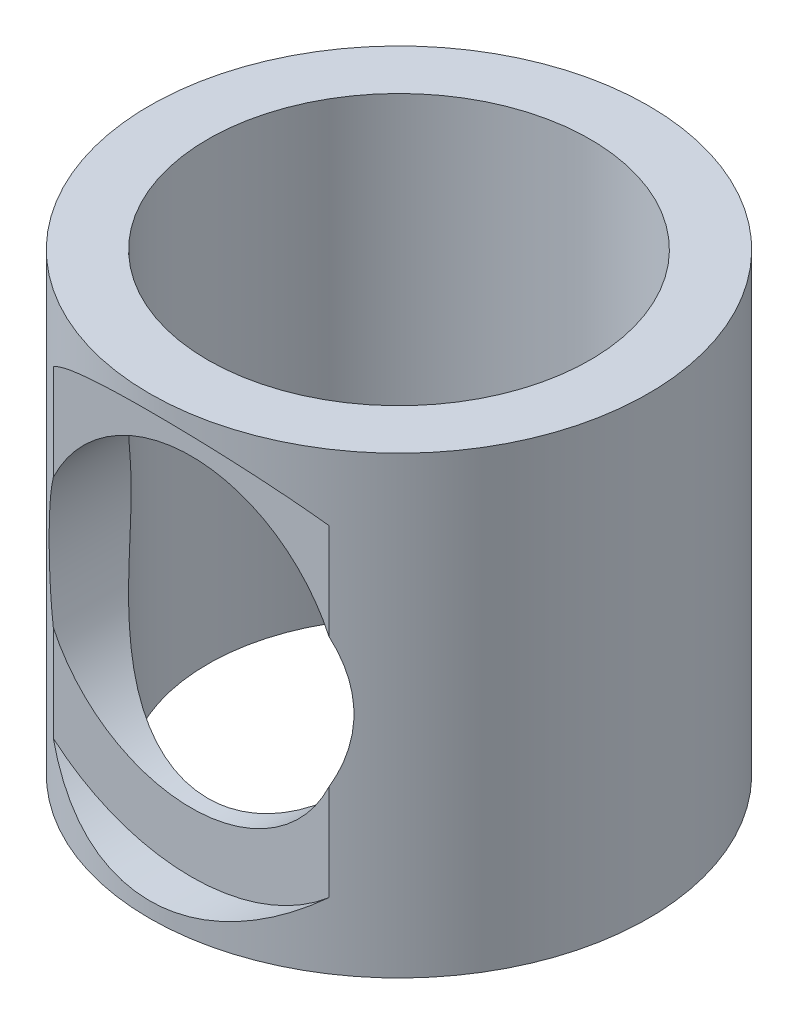
ISO-10303-21;
HEADER;
FILE_DESCRIPTION(('STEP AP214'),'2;1');
FILE_NAME('part.step','',(''),(''),'','','');
FILE_SCHEMA(('AUTOMOTIVE_DESIGN { 1 0 10303 214 1 1 1 1 }'));
ENDSEC;
DATA;
#1=APPLICATION_CONTEXT('core data for automotive mechanical design processes');
#2=APPLICATION_PROTOCOL_DEFINITION('international standard','automotive_design',2000,#1);
#3=PRODUCT_CONTEXT('',#1,'mechanical');
#4=PRODUCT('Part','Part','',(#3));
#5=PRODUCT_RELATED_PRODUCT_CATEGORY('part','',(#4));
#6=PRODUCT_DEFINITION_FORMATION('','',#4);
#7=PRODUCT_DEFINITION_CONTEXT('part definition',#1,'design');
#8=PRODUCT_DEFINITION('design','',#6,#7);
#9=PRODUCT_DEFINITION_SHAPE('','',#8);
#10=(LENGTH_UNIT() NAMED_UNIT(*) SI_UNIT(.MILLI.,.METRE.));
#11=(NAMED_UNIT(*) PLANE_ANGLE_UNIT() SI_UNIT($,.RADIAN.));
#12=(NAMED_UNIT(*) SI_UNIT($,.STERADIAN.) SOLID_ANGLE_UNIT());
#13=UNCERTAINTY_MEASURE_WITH_UNIT(LENGTH_MEASURE(1.E-05),#10,'distance_accuracy_value','');
#14=(GEOMETRIC_REPRESENTATION_CONTEXT(3) GLOBAL_UNCERTAINTY_ASSIGNED_CONTEXT((#13)) GLOBAL_UNIT_ASSIGNED_CONTEXT((#10,
#11,#12)) REPRESENTATION_CONTEXT('',''));
#15=CARTESIAN_POINT('',(0.,0.,0.));
#16=DIRECTION('',(0.,0.,1.));
#17=DIRECTION('',(1.,0.,0.));
#18=AXIS2_PLACEMENT_3D('',#15,#16,#17);
#19=CARTESIAN_POINT('',(0.,-16.4,0.));
#20=DIRECTION('',(0.,1.,0.));
#21=DIRECTION('',(0.,0.,1.));
#22=AXIS2_PLACEMENT_3D('',#19,#20,#21);
#23=CYLINDRICAL_SURFACE('',#22,9.);
#24=CARTESIAN_POINT('',(0.,-16.4,0.));
#25=DIRECTION('',(0.,1.,0.));
#26=DIRECTION('',(0.,0.,1.));
#27=AXIS2_PLACEMENT_3D('',#24,#25,#26);
#28=CIRCLE('',#27,9.);
#29=CARTESIAN_POINT('',(0.,-16.4,9.));
#30=VERTEX_POINT('',#29);
#31=EDGE_CURVE('E98',#30,#30,#28,.T.);
#32=ORIENTED_EDGE('',*,*,#31,.T.);
#33=EDGE_LOOP('',(#32));
#34=FACE_BOUND('',#33,.T.);
#35=CARTESIAN_POINT('',(0.,0.,0.));
#36=DIRECTION('',(0.,1.,0.));
#37=DIRECTION('',(0.,0.,1.));
#38=AXIS2_PLACEMENT_3D('',#35,#36,#37);
#39=CIRCLE('',#38,9.);
#40=CARTESIAN_POINT('',(0.,0.,9.));
#41=VERTEX_POINT('',#40);
#42=EDGE_CURVE('E104',#41,#41,#39,.T.);
#43=ORIENTED_EDGE('',*,*,#42,.F.);
#44=EDGE_LOOP('',(#43));
#45=FACE_BOUND('',#44,.T.);
#46=DIRECTION('',(0.,1.,0.));
#47=VECTOR('',#46,1.);
#48=CARTESIAN_POINT('',(-4.9749371855331,-16.4,7.5));
#49=LINE('',#48,#47);
#50=CARTESIAN_POINT('',(-4.9749371855331,-14.0114111883432,7.5));
#51=VERTEX_POINT('',#50);
#52=CARTESIAN_POINT('',(-4.9749371855331,-10.5452078799117,7.5));
#53=VERTEX_POINT('',#52);
#54=EDGE_CURVE('E89',#51,#53,#49,.T.);
#55=ORIENTED_EDGE('',*,*,#54,.T.);
#56=CARTESIAN_POINT('',(0.,-13.7,9.));
#57=CARTESIAN_POINT('',(-0.140320630117878,-13.6999990432062,8.99999909466136));
#58=CARTESIAN_POINT('',(-0.280664325059528,-13.6946221419773,8.99671042745866));
#59=CARTESIAN_POINT('',(-0.560285969297445,-13.6731854153599,8.98363446958722));
#60=CARTESIAN_POINT('',(-0.699563327861167,-13.6571200486794,8.97384380805122));
#61=CARTESIAN_POINT('',(-0.976151591572798,-13.6144934275367,8.9479858868973));
#62=CARTESIAN_POINT('',(-1.11345878047182,-13.5879145016786,8.93190806021111));
#63=CARTESIAN_POINT('',(-1.38492990005798,-13.524604063471,8.89386132037186));
#64=CARTESIAN_POINT('',(-1.51909246754203,-13.4878682332514,8.87188990187292));
#65=CARTESIAN_POINT('',(-1.78263645895926,-13.4049191327806,8.82270211631877));
#66=CARTESIAN_POINT('',(-1.91203991660257,-13.3587584910183,8.79551492315217));
#67=CARTESIAN_POINT('',(-2.16613234332127,-13.2573322993172,8.73641340897566));
#68=CARTESIAN_POINT('',(-2.29081946752619,-13.2020632308412,8.70449726167851));
#69=CARTESIAN_POINT('',(-2.65669593582049,-13.0234326328182,8.60266649502986));
#70=CARTESIAN_POINT('',(-2.89001661117095,-12.8871467777588,8.52660811005578));
#71=CARTESIAN_POINT('',(-3.34891610547489,-12.5724437402154,8.35758798657437));
#72=CARTESIAN_POINT('',(-3.57247114082575,-12.3915692902006,8.26377048053451));
#73=CARTESIAN_POINT('',(-3.98814984579349,-11.9982373622157,8.07137598962145));
#74=CARTESIAN_POINT('',(-4.18023164738023,-11.7857385203877,7.97279288723892));
#75=CARTESIAN_POINT('',(-4.45359431785187,-11.4313417915118,7.82165306001234));
#76=CARTESIAN_POINT('',(-4.54670436056964,-11.2989883219654,7.76774515933184));
#77=CARTESIAN_POINT('',(-4.72136793391075,-11.0257763111044,7.66283603334586));
#78=CARTESIAN_POINT('',(-4.8029194445551,-10.8849162892963,7.61183531703114));
#79=CARTESIAN_POINT('',(-5.02895084361821,-10.4507272252221,7.46603914343542));
#80=CARTESIAN_POINT('',(-5.1553418835838,-10.1451008428276,7.37813931813357));
#81=CARTESIAN_POINT('',(-5.32776453335166,-9.58827933784976,7.25419759048653));
#82=CARTESIAN_POINT('',(-5.38597609358415,-9.34251843238286,7.21068977998146));
#83=CARTESIAN_POINT('',(-5.44765014527462,-8.96758722740646,7.1640566655145));
#84=CARTESIAN_POINT('',(-5.463933597212,-8.84158728807766,7.15161767781163));
#85=CARTESIAN_POINT('',(-5.48775194768396,-8.58825916899246,7.13335987667991));
#86=CARTESIAN_POINT('',(-5.49528670810963,-8.46093096829984,7.12754116776036));
#87=CARTESIAN_POINT('',(-5.50148267930541,-8.20564574345148,7.12275928601538));
#88=CARTESIAN_POINT('',(-5.50012388031762,-8.07768794900362,7.12381157233655));
#89=CARTESIAN_POINT('',(-5.48851154377157,-7.82242054629702,7.13276205258463));
#90=CARTESIAN_POINT('',(-5.47825796107315,-7.69511094133109,7.14066028125404));
#91=CARTESIAN_POINT('',(-5.4490091669784,-7.44202203776785,7.16300474248471));
#92=CARTESIAN_POINT('',(-5.43000983053673,-7.31624349007981,7.17745406490368));
#93=CARTESIAN_POINT('',(-5.3835489247727,-7.06708919354641,7.21236688765609));
#94=CARTESIAN_POINT('',(-5.35608387779487,-6.94371445435466,7.23283285942751));
#95=CARTESIAN_POINT('',(-5.26260147274339,-6.58258635514391,7.30143669255829));
#96=CARTESIAN_POINT('',(-5.18493883957635,-6.34918929901148,7.35723458839015));
#97=CARTESIAN_POINT('',(-5.00116477145739,-5.89830623444891,7.48336153077569));
#98=CARTESIAN_POINT('',(-4.89504308293793,-5.68082599673934,7.55369581257306));
#99=CARTESIAN_POINT('',(-4.63534952776924,-5.22613390976096,7.71628295799306));
#100=CARTESIAN_POINT('',(-4.47667243069761,-4.99243289140703,7.81020139243674));
#101=CARTESIAN_POINT('',(-4.1260456433473,-4.55240542008156,8.00097319017906));
#102=CARTESIAN_POINT('',(-3.93406298979712,-4.34610644811324,8.09782938192896));
#103=CARTESIAN_POINT('',(-3.60763116888638,-4.04532759564363,8.24634640770807));
#104=CARTESIAN_POINT('',(-3.48332052784539,-3.94053533098166,8.2997510389037));
#105=CARTESIAN_POINT('',(-3.22509801164116,-3.74183192208319,8.40345586032043));
#106=CARTESIAN_POINT('',(-3.09118949862222,-3.64791699736955,8.45375712627491));
#107=CARTESIAN_POINT('',(-2.81438962227263,-3.4717739964979,8.54989351957859));
#108=CARTESIAN_POINT('',(-2.67149899756097,-3.3895449611918,8.59572901336982));
#109=CARTESIAN_POINT('',(-2.37752441744433,-3.23766820200902,8.68163660057312));
#110=CARTESIAN_POINT('',(-2.22644146795147,-3.16801893802609,8.72170939937325));
#111=CARTESIAN_POINT('',(-1.92630313993462,-3.045970534419,8.79270754888431));
#112=CARTESIAN_POINT('',(-1.77765994086073,-2.99279274334542,8.824034740525));
#113=CARTESIAN_POINT('',(-1.47514380894459,-2.89914997814178,8.8796165147892));
#114=CARTESIAN_POINT('',(-1.32127173530647,-2.85868292648101,8.90387225317309));
#115=CARTESIAN_POINT('',(-1.00975670206422,-2.79114003074001,8.94455362843908));
#116=CARTESIAN_POINT('',(-0.852117696517168,-2.76405074033224,8.96098712704998));
#117=CARTESIAN_POINT('',(-0.5344466993168,-2.72368830331122,8.98552894656546));
#118=CARTESIAN_POINT('',(-0.374415078679694,-2.7104130366797,8.99363854492437));
#119=CARTESIAN_POINT('',(-0.0763428712488212,-2.6988030871287,9.00073079501644));
#120=CARTESIAN_POINT('',(0.0616029459194025,-2.69861900539326,9.00084321349574));
#121=CARTESIAN_POINT('',(0.336975499558356,-2.70860449258568,8.99474333497655));
#122=CARTESIAN_POINT('',(0.474402267344441,-2.71877342654542,8.98853142585986));
#123=CARTESIAN_POINT('',(0.747678254996305,-2.74932284179092,8.96993507884819));
#124=CARTESIAN_POINT('',(0.883527583445614,-2.76970261589546,8.95755106842022));
#125=CARTESIAN_POINT('',(1.15268067966745,-2.82040118157957,8.92690743357053));
#126=CARTESIAN_POINT('',(1.28598439146398,-2.85072019144899,8.90864768010335));
#127=CARTESIAN_POINT('',(1.54509645170536,-2.91983960114835,8.86731919675696));
#128=CARTESIAN_POINT('',(1.67100912828581,-2.95834899282325,8.84441648984859));
#129=CARTESIAN_POINT('',(1.91893941419021,-3.04394599717721,8.79395842054805));
#130=CARTESIAN_POINT('',(2.04095575869607,-3.09103636278291,8.76640156523178));
#131=CARTESIAN_POINT('',(2.40016928301883,-3.2445087830621,8.67755033615854));
#132=CARTESIAN_POINT('',(2.63072425067249,-3.36314446825966,8.61004324830333));
#133=CARTESIAN_POINT('',(3.09274563378639,-3.64310151796286,8.45578461223622));
#134=CARTESIAN_POINT('',(3.32186846125941,-3.80755756871491,8.36776804337219));
#135=CARTESIAN_POINT('',(3.75098669115101,-4.167792874161,8.18441369069338));
#136=CARTESIAN_POINT('',(3.95094814013234,-4.36360809361603,8.0890675669462));
#137=CARTESIAN_POINT('',(4.34434965513174,-4.81216101998426,7.88556318802296));
#138=CARTESIAN_POINT('',(4.5331336620455,-5.06902235619793,7.77744129782893));
#139=CARTESIAN_POINT('',(4.86525646838855,-5.61518695629085,7.57411441787219));
#140=CARTESIAN_POINT('',(5.00863641800685,-5.90446052078361,7.47889777697765));
#141=CARTESIAN_POINT('',(5.21893504874632,-6.4456341054072,7.33318001562168));
#142=CARTESIAN_POINT('',(5.29565437277669,-6.69226058812352,7.27746922744331));
#143=CARTESIAN_POINT('',(5.38448104616078,-7.07117896290014,7.21170429345097));
#144=CARTESIAN_POINT('',(5.40971253573952,-7.19895951684521,7.19275119748605));
#145=CARTESIAN_POINT('',(5.45111024536707,-7.45675594839651,7.16143037165602));
#146=CARTESIAN_POINT('',(5.46728019366359,-7.58677088397028,7.14905993355184));
#147=CARTESIAN_POINT('',(5.49035446517654,-7.8487379948186,7.13135472031657));
#148=CARTESIAN_POINT('',(5.49721341703763,-7.98069651120785,7.12605439916844));
#149=CARTESIAN_POINT('',(5.50140322550147,-8.24485593087546,7.12282036199894));
#150=CARTESIAN_POINT('',(5.49873408527627,-8.37705683407312,7.12488664352512));
#151=CARTESIAN_POINT('',(5.48390762991169,-8.64066555842503,7.13630478485499));
#152=CARTESIAN_POINT('',(5.47174636440937,-8.77207302642252,7.1456596779766));
#153=CARTESIAN_POINT('',(5.43814932817368,-9.03298070097074,7.17125954310904));
#154=CARTESIAN_POINT('',(5.41671358520128,-9.16248091322918,7.1875044944961));
#155=CARTESIAN_POINT('',(5.34217406756867,-9.53083563922712,7.24326858634026));
#156=CARTESIAN_POINT('',(5.27776835450033,-9.76631001752043,7.29071876393038));
#157=CARTESIAN_POINT('',(5.12015116454601,-10.2230171915979,7.40224790716019));
#158=CARTESIAN_POINT('',(5.02692853721936,-10.4442444344752,7.466333308106));
#159=CARTESIAN_POINT('',(4.79825682952517,-10.9021701856601,7.61564577346919));
#160=CARTESIAN_POINT('',(4.65856167633644,-11.1361772016627,7.70260343405216));
#161=CARTESIAN_POINT('',(4.34744853793559,-11.5798167890446,7.88238228917716));
#162=CARTESIAN_POINT('',(4.17600428535326,-11.789428941962,7.9752082966595));
#163=CARTESIAN_POINT('',(3.88032029560083,-12.1010925515842,8.1214621809448));
#164=CARTESIAN_POINT('',(3.76554429164897,-12.2120096022593,8.17544010231517));
#165=CARTESIAN_POINT('',(3.52629006270094,-12.4238359376264,8.28144756706766));
#166=CARTESIAN_POINT('',(3.40181493151642,-12.524748390419,8.33347772396827));
#167=CARTESIAN_POINT('',(3.14352666928559,-12.715981407373,8.43430398255425));
#168=CARTESIAN_POINT('',(3.00970410102269,-12.8062910129371,8.48309671594019));
#169=CARTESIAN_POINT('',(2.73352285621453,-12.9753583160838,8.57607513183398));
#170=CARTESIAN_POINT('',(2.59116891820759,-13.0541223441143,8.62026333513669));
#171=CARTESIAN_POINT('',(2.30108604047364,-13.1980778577546,8.7021454993216));
#172=CARTESIAN_POINT('',(2.15348522815612,-13.2634725909146,8.73993492642416));
#173=CARTESIAN_POINT('',(1.85180454065278,-13.3814116878962,8.80878736005156));
#174=CARTESIAN_POINT('',(1.6977285002784,-13.4339635353719,8.83985428261952));
#175=CARTESIAN_POINT('',(1.38470912764011,-13.5253251943399,8.89425348934573));
#176=CARTESIAN_POINT('',(1.22578097443342,-13.5641738742786,8.91760763824902));
#177=CARTESIAN_POINT('',(0.904205245578934,-13.6276359253105,8.95592471432299));
#178=CARTESIAN_POINT('',(0.741560719745743,-13.652260561897,8.97089428182625));
#179=CARTESIAN_POINT('',(0.48206562643503,-13.6796820137039,8.98759467187138));
#180=CARTESIAN_POINT('',(0.385879788833115,-13.6872955384542,8.9922409367462));
#181=CARTESIAN_POINT('',(0.193132955268608,-13.69745499317,8.99844399301966));
#182=CARTESIAN_POINT('',(0.0965719399777635,-13.7000006584879,9.00000062307523));
#183=CARTESIAN_POINT('',(0.,-13.7,9.));
#184=B_SPLINE_CURVE_WITH_KNOTS('',3,(#56,#57,#58,#59,#60,#61,#62,#63,#64,#65,#66,#67,#68,#69,
#70,#71,#72,#73,#74,#75,#76,#77,#78,#79,#80,#81,#82,#83,#84,#85,#86,#87,#88,#89,#90,#91,#92,#93,
#94,#95,#96,#97,#98,#99,#100,#101,#102,#103,#104,#105,#106,#107,#108,#109,#110,#111,#112,#113,
#114,#115,#116,#117,#118,#119,#120,#121,#122,#123,#124,#125,#126,#127,#128,#129,#130,#131,#132,
#133,#134,#135,#136,#137,#138,#139,#140,#141,#142,#143,#144,#145,#146,#147,#148,#149,#150,#151,
#152,#153,#154,#155,#156,#157,#158,#159,#160,#161,#162,#163,#164,#165,#166,#167,#168,#169,#170,
#171,#172,#173,#174,#175,#176,#177,#178,#179,#180,#181,#182,#183),.UNSPECIFIED.,.T.,.F.,(4,2,2,
2,2,2,2,2,2,2,2,2,2,2,2,2,2,2,2,2,2,2,2,2,2,2,2,2,2,2,2,2,2,2,2,2,2,2,2,2,2,2,2,2,2,2,2,2,2,2,2,
2,2,2,2,2,2,2,2,2,2,2,2,4),(0.,0.420861501952953,0.841941364125669,1.26373201367031,
1.68570224992285,2.10537764867309,2.52521554746541,3.36388988870174,4.26798834882855,
5.17327991131417,5.68440755699094,6.195624417923,7.21531960680824,7.98071007419804,
8.36325464021101,8.74580524508054,9.12921685192586,9.51263040455948,9.89622498463482,
10.2799773531992,11.0335602063171,11.7874149348685,12.6771713448532,13.5678134440934,
14.0806638526686,14.5933354790708,15.1059650023574,15.6185317232402,16.1006667256917,
16.5827228836247,17.0642935234638,17.5457902464478,17.9591075204018,18.3723994464293,
18.7856627526872,19.198935135823,19.5994380284524,20.0000696363592,20.8007309886991,
21.6837143939643,22.5677178119649,23.5729673701187,24.5773032347886,25.3664337319315,
25.7608677135141,26.155139291236,26.5513252919278,26.9475111607232,27.3438619992144,
27.740211651331,28.4830849823727,29.226246122014,30.0813847058871,30.9372339687094,
31.4422051461578,31.9470159029782,32.452343898713,32.9573937779755,33.4540760698648,
33.9504682471306,34.4454408876628,34.9400209686791,35.2296525745821,35.5192993048698),.UNSPECIFIED.);
#185=CARTESIAN_POINT('',(-4.9749371855331,-5.85479212008828,7.5));
#186=VERTEX_POINT('',#185);
#187=EDGE_CURVE('E81',#53,#186,#184,.T.);
#188=ORIENTED_EDGE('',*,*,#187,.T.);
#189=CARTESIAN_POINT('',(-4.9749371855331,-2.38858881165684,7.5));
#190=VERTEX_POINT('',#189);
#191=EDGE_CURVE('E63',#186,#190,#49,.T.);
#192=ORIENTED_EDGE('',*,*,#191,.T.);
#193=CARTESIAN_POINT('',(-4.9749371855331,-2.38858881165684,7.5));
#194=CARTESIAN_POINT('',(-4.83538593931332,-2.26913294866779,7.59257794785406));
#195=CARTESIAN_POINT('',(-4.6906432725018,-2.15392686385819,7.68296961871018));
#196=CARTESIAN_POINT('',(-4.3907935379065,-1.93276709850783,7.85818559626848));
#197=CARTESIAN_POINT('',(-4.23567556139986,-1.82682343532441,7.94300385126487));
#198=CARTESIAN_POINT('',(-3.91382969787613,-1.62421648773562,8.10646863734327));
#199=CARTESIAN_POINT('',(-3.74700327798459,-1.52765386689214,8.18504685617827));
#200=CARTESIAN_POINT('',(-3.40358781834618,-1.34611062657559,8.33370149169829));
#201=CARTESIAN_POINT('',(-3.22700167152365,-1.26112660064644,8.40378040823337));
#202=CARTESIAN_POINT('',(-2.86344007908156,-1.10332848364951,8.53453476797041));
#203=CARTESIAN_POINT('',(-2.67640013947322,-1.03060445889239,8.59514039911208));
#204=CARTESIAN_POINT('',(-2.29413374755711,-0.899295580281349,8.70496922124139));
#205=CARTESIAN_POINT('',(-2.09890658716329,-0.840711952356605,8.75419142530522));
#206=CARTESIAN_POINT('',(-1.70263472905569,-0.739089517273632,8.83979290076869));
#207=CARTESIAN_POINT('',(-1.50161942548323,-0.695983412423246,8.87622775674902));
#208=CARTESIAN_POINT('',(-1.09483370333041,-0.62593875379249,8.93552204956123));
#209=CARTESIAN_POINT('',(-0.889064338674854,-0.598996651670846,8.95838446581979));
#210=CARTESIAN_POINT('',(-0.504611866231077,-0.564581680773327,8.98760511905303));
#211=CARTESIAN_POINT('',(-0.326268020799892,-0.554873868186965,8.99585745012381));
#212=CARTESIAN_POINT('',(0.0308289642616837,-0.547978823698594,9.00171782451672));
#213=CARTESIAN_POINT('',(0.209582060931803,-0.550790332876436,8.99932693810137));
#214=CARTESIAN_POINT('',(0.566043839974028,-0.568882299214894,8.98395431070988));
#215=CARTESIAN_POINT('',(0.743752198058014,-0.584166441299601,8.97096943983922));
#216=CARTESIAN_POINT('',(1.09662524654213,-0.626922772818042,8.93470035666708));
#217=CARTESIAN_POINT('',(1.2717899699768,-0.654394803819519,8.91141627824662));
#218=CARTESIAN_POINT('',(1.60502586724166,-0.718492690937906,8.85721079824029));
#219=CARTESIAN_POINT('',(1.7633812767678,-0.754259834030994,8.82700796429608));
#220=CARTESIAN_POINT('',(2.07597553681014,-0.835293202349795,8.75876296740066));
#221=CARTESIAN_POINT('',(2.23021278366946,-0.880563068938312,8.72071779943471));
#222=CARTESIAN_POINT('',(2.53395822521544,-0.980087747937707,8.63735452002649));
#223=CARTESIAN_POINT('',(2.68346023116088,-1.03435378397219,8.59202732573752));
#224=CARTESIAN_POINT('',(2.97696823477174,-1.15123277108505,8.49479653312952));
#225=CARTESIAN_POINT('',(3.1209734835388,-1.21384685434773,8.44289204282757));
#226=CARTESIAN_POINT('',(3.42111465093929,-1.35533675751106,8.32617048797939));
#227=CARTESIAN_POINT('',(3.57644074220915,-1.43526823932306,8.26055106598876));
#228=CARTESIAN_POINT('',(3.87912900829074,-1.60417489724564,8.12280877571358));
#229=CARTESIAN_POINT('',(4.02648871383188,-1.69315285307222,8.05068390926979));
#230=CARTESIAN_POINT('',(4.31224557199698,-1.87892794401,7.9012912395352));
#231=CARTESIAN_POINT('',(4.45068222057337,-1.9756856453221,7.82404968431822));
#232=CARTESIAN_POINT('',(4.71912396839388,-2.17667562229237,7.66512893926958));
#233=CARTESIAN_POINT('',(4.84913612437345,-2.28090148403166,7.58345357162614));
#234=CARTESIAN_POINT('',(4.9749371855331,-2.38858881165684,7.5));
#235=B_SPLINE_CURVE_WITH_KNOTS('',3,(#193,#194,#195,#196,#197,#198,#199,#200,#201,#202,#203,
#204,#205,#206,#207,#208,#209,#210,#211,#212,#213,#214,#215,#216,#217,#218,#219,#220,#221,#222,
#223,#224,#225,#226,#227,#228,#229,#230,#231,#232,#233,#234),.UNSPECIFIED.,.F.,.F.,(4,2,2,2,2,2,
2,2,2,2,2,2,2,2,2,2,2,2,2,2,4),(0.,0.617101711061569,1.23486277148969,1.85865291454196,
2.48225913860273,3.11026385542104,3.73832299878781,4.36361723351062,4.98877415261989,
5.52443887357661,6.06004973028305,6.59581888557948,7.13158107653361,7.62645086299664,
8.12151062665323,8.61719274044138,9.11294214846585,9.67221099093718,10.2316522026703,
10.7884176646451,11.3447105594037),.UNSPECIFIED.);
#236=CARTESIAN_POINT('',(4.9749371855331,-2.38858881165684,7.5));
#237=VERTEX_POINT('',#236);
#238=EDGE_CURVE('E115',#190,#237,#235,.T.);
#239=ORIENTED_EDGE('',*,*,#238,.T.);
#240=DIRECTION('',(0.,1.,0.));
#241=VECTOR('',#240,1.);
#242=CARTESIAN_POINT('',(4.9749371855331,-16.4,7.5));
#243=LINE('',#242,#241);
#244=CARTESIAN_POINT('',(4.9749371855331,-5.85479212008828,7.5));
#245=VERTEX_POINT('',#244);
#246=EDGE_CURVE('E86',#237,#245,#243,.F.);
#247=ORIENTED_EDGE('',*,*,#246,.T.);
#248=CARTESIAN_POINT('',(4.9749371855331,-10.5452078799117,7.5));
#249=VERTEX_POINT('',#248);
#250=EDGE_CURVE('E55',#245,#249,#184,.T.);
#251=ORIENTED_EDGE('',*,*,#250,.T.);
#252=CARTESIAN_POINT('',(4.9749371855331,-14.0114111883432,7.5));
#253=VERTEX_POINT('',#252);
#254=EDGE_CURVE('E181',#249,#253,#243,.F.);
#255=ORIENTED_EDGE('',*,*,#254,.T.);
#256=CARTESIAN_POINT('',(4.9749371855331,-14.0114111883432,7.5));
#257=CARTESIAN_POINT('',(4.83538593931332,-14.1308670513322,7.59257794785406));
#258=CARTESIAN_POINT('',(4.6906432725018,-14.2460731361418,7.68296961871018));
#259=CARTESIAN_POINT('',(4.3907935379065,-14.4672329014922,7.85818559626848));
#260=CARTESIAN_POINT('',(4.23567556139986,-14.5731765646756,7.94300385126487));
#261=CARTESIAN_POINT('',(3.91382969787613,-14.7757835122644,8.10646863734327));
#262=CARTESIAN_POINT('',(3.74700327798459,-14.8723461331079,8.18504685617827));
#263=CARTESIAN_POINT('',(3.40358781834618,-15.0538893734244,8.33370149169829));
#264=CARTESIAN_POINT('',(3.22700167152365,-15.1388733993536,8.40378040823337));
#265=CARTESIAN_POINT('',(2.86344007908156,-15.2966715163505,8.53453476797041));
#266=CARTESIAN_POINT('',(2.67640013947321,-15.3693955411076,8.59514039911208));
#267=CARTESIAN_POINT('',(2.2941337475571,-15.5007044197186,8.70496922124139));
#268=CARTESIAN_POINT('',(2.09890658716329,-15.5592880476434,8.75419142530522));
#269=CARTESIAN_POINT('',(1.70263472905569,-15.6609104827264,8.83979290076869));
#270=CARTESIAN_POINT('',(1.50161942548323,-15.7040165875768,8.87622775674902));
#271=CARTESIAN_POINT('',(1.09483370333041,-15.7740612462075,8.93552204956123));
#272=CARTESIAN_POINT('',(0.889064338674853,-15.8010033483292,8.95838446581979));
#273=CARTESIAN_POINT('',(0.504611866231075,-15.8354183192267,8.98760511905303));
#274=CARTESIAN_POINT('',(0.32626802079989,-15.845126131813,8.99585745012381));
#275=CARTESIAN_POINT('',(-0.0308289642616846,-15.8520211763014,9.00171782451672));
#276=CARTESIAN_POINT('',(-0.209582060931804,-15.8492096671236,8.99932693810137));
#277=CARTESIAN_POINT('',(-0.566043839974029,-15.8311177007851,8.98395431070988));
#278=CARTESIAN_POINT('',(-0.743752198058014,-15.8158335587004,8.97096943983922));
#279=CARTESIAN_POINT('',(-1.09662524654213,-15.773077227182,8.93470035666708));
#280=CARTESIAN_POINT('',(-1.2717899699768,-15.7456051961805,8.91141627824662));
#281=CARTESIAN_POINT('',(-1.60502586724166,-15.6815073090621,8.85721079824029));
#282=CARTESIAN_POINT('',(-1.7633812767678,-15.645740165969,8.82700796429608));
#283=CARTESIAN_POINT('',(-2.07597553681014,-15.5647067976502,8.75876296740066));
#284=CARTESIAN_POINT('',(-2.23021278366946,-15.5194369310617,8.72071779943471));
#285=CARTESIAN_POINT('',(-2.53395822521544,-15.4199122520623,8.63735452002649));
#286=CARTESIAN_POINT('',(-2.68346023116088,-15.3656462160278,8.59202732573752));
#287=CARTESIAN_POINT('',(-2.97696823477174,-15.2487672289149,8.49479653312952));
#288=CARTESIAN_POINT('',(-3.1209734835388,-15.1861531456523,8.44289204282757));
#289=CARTESIAN_POINT('',(-3.42111465093929,-15.0446632424889,8.32617048797939));
#290=CARTESIAN_POINT('',(-3.57644074220915,-14.9647317606769,8.26055106598876));
#291=CARTESIAN_POINT('',(-3.87912900829074,-14.7958251027544,8.12280877571358));
#292=CARTESIAN_POINT('',(-4.02648871383188,-14.7068471469278,8.05068390926979));
#293=CARTESIAN_POINT('',(-4.31224557199698,-14.52107205599,7.9012912395352));
#294=CARTESIAN_POINT('',(-4.45068222057337,-14.4243143546779,7.82404968431822));
#295=CARTESIAN_POINT('',(-4.71912396839388,-14.2233243777076,7.66512893926958));
#296=CARTESIAN_POINT('',(-4.84913612437345,-14.1190985159683,7.58345357162614));
#297=CARTESIAN_POINT('',(-4.9749371855331,-14.0114111883432,7.5));
#298=B_SPLINE_CURVE_WITH_KNOTS('',3,(#256,#257,#258,#259,#260,#261,#262,#263,#264,#265,#266,
#267,#268,#269,#270,#271,#272,#273,#274,#275,#276,#277,#278,#279,#280,#281,#282,#283,#284,#285,
#286,#287,#288,#289,#290,#291,#292,#293,#294,#295,#296,#297),.UNSPECIFIED.,.F.,.F.,(4,2,2,2,2,2,
2,2,2,2,2,2,2,2,2,2,2,2,2,2,4),(0.,0.61710171106157,1.23486277148969,1.85865291454197,
2.48225913860273,3.11026385542104,3.73832299878781,4.36361723351062,4.98877415261989,
5.52443887357662,6.06004973028305,6.59581888557948,7.13158107653362,7.62645086299664,
8.12151062665323,8.61719274044138,9.11294214846586,9.67221099093719,10.2316522026703,
10.7884176646451,11.3447105594037),.UNSPECIFIED.);
#299=EDGE_CURVE('E102',#253,#51,#298,.T.);
#300=ORIENTED_EDGE('',*,*,#299,.T.);
#301=EDGE_LOOP('',(#55,#188,#192,#239,#247,#251,#255,#300));
#302=FACE_BOUND('',#301,.T.);
#303=ADVANCED_FACE('F39',(#34,#45,#302),#23,.T.);
#304=CARTESIAN_POINT('',(0.,-16.4,0.));
#305=DIRECTION('',(0.,1.,0.));
#306=DIRECTION('',(0.,0.,1.));
#307=AXIS2_PLACEMENT_3D('',#304,#305,#306);
#308=CYLINDRICAL_SURFACE('',#307,6.9);
#309=CARTESIAN_POINT('',(0.,-16.4,0.));
#310=DIRECTION('',(0.,1.,0.));
#311=DIRECTION('',(0.,0.,1.));
#312=AXIS2_PLACEMENT_3D('',#309,#310,#311);
#313=CIRCLE('',#312,6.9);
#314=CARTESIAN_POINT('',(0.,-16.4,6.9));
#315=VERTEX_POINT('',#314);
#316=EDGE_CURVE('E164',#315,#315,#313,.T.);
#317=ORIENTED_EDGE('',*,*,#316,.F.);
#318=EDGE_LOOP('',(#317));
#319=FACE_BOUND('',#318,.T.);
#320=CARTESIAN_POINT('',(0.,0.,0.));
#321=DIRECTION('',(0.,1.,0.));
#322=DIRECTION('',(0.,0.,1.));
#323=AXIS2_PLACEMENT_3D('',#320,#321,#322);
#324=CIRCLE('',#323,6.9);
#325=CARTESIAN_POINT('',(0.,0.,6.9));
#326=VERTEX_POINT('',#325);
#327=EDGE_CURVE('E167',#326,#326,#324,.T.);
#328=ORIENTED_EDGE('',*,*,#327,.T.);
#329=EDGE_LOOP('',(#328));
#330=FACE_BOUND('',#329,.T.);
#331=CARTESIAN_POINT('',(0.,-13.7,6.9));
#332=CARTESIAN_POINT('',(-0.132245439097948,-13.6999999925162,6.89999999405859));
#333=CARTESIAN_POINT('',(-0.264490855910267,-13.6952229012277,6.89619036036954));
#334=CARTESIAN_POINT('',(-0.527914941544145,-13.6761987503241,6.88104060438827));
#335=CARTESIAN_POINT('',(-0.659093147311223,-13.6619477809856,6.86969737309835));
#336=CARTESIAN_POINT('',(-0.919431265885258,-13.6242021691211,6.83972496180058));
#337=CARTESIAN_POINT('',(-1.04858844122406,-13.6006959564623,6.82108666228074));
#338=CARTESIAN_POINT('',(-1.30382232410438,-13.5448223464713,6.77693391423116));
#339=CARTESIAN_POINT('',(-1.42989760677576,-13.5124509317902,6.75141634837976));
#340=CARTESIAN_POINT('',(-1.67727555630358,-13.4395856364394,6.69423260318722));
#341=CARTESIAN_POINT('',(-1.79860461960876,-13.3991478501599,6.66260893246967));
#342=CARTESIAN_POINT('',(-2.03677246851833,-13.3105506232177,6.59370588789604));
#343=CARTESIAN_POINT('',(-2.15360926973399,-13.2623878176415,6.55642404980137));
#344=CARTESIAN_POINT('',(-2.49652549857014,-13.1071592815409,6.43706411163052));
#345=CARTESIAN_POINT('',(-2.71523708452438,-12.9892854050625,6.34741747334666));
#346=CARTESIAN_POINT('',(-3.06227406488555,-12.7716255062034,6.18517335522886));
#347=CARTESIAN_POINT('',(-3.19681138913163,-12.6784814556834,6.11655320135133));
#348=CARTESIAN_POINT('',(-3.45544654667747,-12.482081560397,5.97424761410312));
#349=CARTESIAN_POINT('',(-3.57954482832742,-12.3788261503196,5.90056239852085));
#350=CARTESIAN_POINT('',(-3.81741422839071,-12.1627337140589,5.7495447666352));
#351=CARTESIAN_POINT('',(-3.93115535830925,-12.0498705876073,5.67220268666934));
#352=CARTESIAN_POINT('',(-4.14782693413572,-11.8153852766617,5.51573926533705));
#353=CARTESIAN_POINT('',(-4.25075859297605,-11.6937640774996,5.43661812481152));
#354=CARTESIAN_POINT('',(-4.4472175469131,-11.4401216676972,5.27716807291742));
#355=CARTESIAN_POINT('',(-4.54057534168322,-11.3079690020765,5.19683935187333));
#356=CARTESIAN_POINT('',(-4.71584776629884,-11.0349790252616,5.03832704919467));
#357=CARTESIAN_POINT('',(-4.79775880984634,-10.8941390121297,4.96014414598828));
#358=CARTESIAN_POINT('',(-4.94945893067109,-10.6040711240609,4.80877321682611));
#359=CARTESIAN_POINT('',(-5.0192810654851,-10.4548676491755,4.73557191265818));
#360=CARTESIAN_POINT('',(-5.14626001707398,-10.147723750948,4.59726123349697));
#361=CARTESIAN_POINT('',(-5.20342762189508,-9.98979091410859,4.5321449869131));
#362=CARTESIAN_POINT('',(-5.31179802948586,-9.63986667847001,4.4048668305912));
#363=CARTESIAN_POINT('',(-5.36071752772764,-9.44638134406338,4.34471291185945));
#364=CARTESIAN_POINT('',(-5.41843793000142,-9.1490663314716,4.27217549861768));
#365=CARTESIAN_POINT('',(-5.43506247610267,-9.04884819029337,4.25095340150013));
#366=CARTESIAN_POINT('',(-5.46282531219813,-8.84649182744058,4.21521702928994));
#367=CARTESIAN_POINT('',(-5.47396626287036,-8.74435456196344,4.20069950130595));
#368=CARTESIAN_POINT('',(-5.49059495794333,-8.53791415018662,4.17894233476979));
#369=CARTESIAN_POINT('',(-5.49603137619341,-8.4335998101552,4.17176878697753));
#370=CARTESIAN_POINT('',(-5.50093818401406,-8.22458712225297,4.16529667467054));
#371=CARTESIAN_POINT('',(-5.50040885206326,-8.11988879253472,4.16599774257216));
#372=CARTESIAN_POINT('',(-5.49339602985921,-7.91098491088726,4.17524042792635));
#373=CARTESIAN_POINT('',(-5.48690915852103,-7.80677967256148,4.18378649765495));
#374=CARTESIAN_POINT('',(-5.46813478044146,-7.59973539855493,4.20829383529112));
#375=CARTESIAN_POINT('',(-5.45584419295713,-7.4968971183302,4.22425904137139));
#376=CARTESIAN_POINT('',(-5.42330420367382,-7.27694061306519,4.26597920203496));
#377=CARTESIAN_POINT('',(-5.40209264104952,-7.16018605487127,4.29289574701379));
#378=CARTESIAN_POINT('',(-5.35269568164528,-6.93015419572755,4.3543308683086));
#379=CARTESIAN_POINT('',(-5.32450506398671,-6.81687956967601,4.38885513365936));
#380=CARTESIAN_POINT('',(-5.26157527505231,-6.59398959680141,4.46410499570523));
#381=CARTESIAN_POINT('',(-5.22682090669171,-6.48438345111083,4.50484494066981));
#382=CARTESIAN_POINT('',(-5.15124308444305,-6.26927759090078,4.59107655198219));
#383=CARTESIAN_POINT('',(-5.11042116458783,-6.16377684691286,4.63656701641455));
#384=CARTESIAN_POINT('',(-5.0019462999592,-5.90690824558276,4.75390553005915));
#385=CARTESIAN_POINT('',(-4.93084873199145,-5.75796070877831,4.82788379402046));
#386=CARTESIAN_POINT('',(-4.77675264673048,-5.46879316452033,4.9804022699154));
#387=CARTESIAN_POINT('',(-4.69374874897316,-5.32857714414097,5.05894453472056));
#388=CARTESIAN_POINT('',(-4.51616338742658,-5.05664784259928,5.21809387452131));
#389=CARTESIAN_POINT('',(-4.4215687312576,-4.92494451568473,5.29870321818271));
#390=CARTESIAN_POINT('',(-4.22110856960403,-4.67034174490692,5.45974132901885));
#391=CARTESIAN_POINT('',(-4.11524488426436,-4.5474408846398,5.54017012321915));
#392=CARTESIAN_POINT('',(-3.88953389874211,-4.3077905169088,5.70098322462057));
#393=CARTESIAN_POINT('',(-3.76940170355139,-4.19127369329422,5.7813154604233));
#394=CARTESIAN_POINT('',(-3.51748264823893,-3.9685007975218,5.93795569632985));
#395=CARTESIAN_POINT('',(-3.38569408687652,-3.86224622788452,6.01426310640946));
#396=CARTESIAN_POINT('',(-3.11101756582443,-3.66122641834975,6.16082366287352));
#397=CARTESIAN_POINT('',(-2.96815594380719,-3.56643520994655,6.23109038490316));
#398=CARTESIAN_POINT('',(-2.67154733580332,-3.38932067286862,6.36389857671459));
#399=CARTESIAN_POINT('',(-2.51780536785348,-3.30699165089717,6.4264435717117));
#400=CARTESIAN_POINT('',(-2.24619951647518,-3.178028089997,6.52526029087372));
#401=CARTESIAN_POINT('',(-2.13081570597069,-3.12795587944549,6.56389964840671));
#402=CARTESIAN_POINT('',(-1.89541491324273,-3.03537146751783,6.63570136852251));
#403=CARTESIAN_POINT('',(-1.77539908957848,-2.99285739042556,6.66886508985819));
#404=CARTESIAN_POINT('',(-1.53133557999626,-2.91593172475172,6.72910139128544));
#405=CARTESIAN_POINT('',(-1.40728894285004,-2.88151804744763,6.75617554151861));
#406=CARTESIAN_POINT('',(-1.15593214153783,-2.82129084091582,6.8036879415388));
#407=CARTESIAN_POINT('',(-1.02862352544005,-2.79547331066273,6.82412927841614));
#408=CARTESIAN_POINT('',(-0.770887193267206,-2.75271754810956,6.85804019976393));
#409=CARTESIAN_POINT('',(-0.640446428629274,-2.73582758647908,6.87147187870806));
#410=CARTESIAN_POINT('',(-0.378135292942836,-2.71143342838601,6.89088588718726));
#411=CARTESIAN_POINT('',(-0.24626492453921,-2.70392921456202,6.89686823050182));
#412=CARTESIAN_POINT('',(0.0177846423366903,-2.69844391590789,6.90124021818436));
#413=CARTESIAN_POINT('',(0.149963802282536,-2.70046170050011,6.89963076395098));
#414=CARTESIAN_POINT('',(0.413518938279113,-2.71398017981294,6.88886035005455));
#415=CARTESIAN_POINT('',(0.544894952362094,-2.72548042194076,6.87969975080373));
#416=CARTESIAN_POINT('',(0.795528101442259,-2.756489872424,6.85505077666501));
#417=CARTESIAN_POINT('',(0.914927110634015,-2.77529964114138,6.84011547795285));
#418=CARTESIAN_POINT('',(1.15138757377884,-2.82051859254463,6.80430989074643));
#419=CARTESIAN_POINT('',(1.26844822621687,-2.84693033472086,6.78343760336945));
#420=CARTESIAN_POINT('',(1.61502888282607,-2.93705932380818,6.71246196980974));
#421=CARTESIAN_POINT('',(1.84011582261884,-3.01169176980615,6.653982565218));
#422=CARTESIAN_POINT('',(2.28804015584062,-3.19230035801947,6.51410625610294));
#423=CARTESIAN_POINT('',(2.50977629975529,-3.30000128701955,6.431464830376));
#424=CARTESIAN_POINT('',(2.93199510185178,-3.54033742053376,6.25029861246511));
#425=CARTESIAN_POINT('',(3.13247703919355,-3.67297347030395,6.15177328186128));
#426=CARTESIAN_POINT('',(3.54711572726825,-3.98716977668113,5.9240165685994));
#427=CARTESIAN_POINT('',(3.7566191620964,-4.17323713061589,5.79250932680664));
#428=CARTESIAN_POINT('',(4.04663117128427,-4.47251239596574,5.59006241603111));
#429=CARTESIAN_POINT('',(4.1394110018888,-4.57584404960302,5.52158369192349));
#430=CARTESIAN_POINT('',(4.31673996089773,-4.78899348611626,5.38408047426752));
#431=CARTESIAN_POINT('',(4.40129100543015,-4.89880974939178,5.31505611184181));
#432=CARTESIAN_POINT('',(4.57896325531889,-5.14856182209033,5.16327985817849));
#433=CARTESIAN_POINT('',(4.67015168244678,-5.28997757408226,5.08069131965819));
#434=CARTESIAN_POINT('',(4.84003004687368,-5.5822341251486,4.91913085448305));
#435=CARTESIAN_POINT('',(4.91871324058505,-5.73307994881789,4.84016089541284));
#436=CARTESIAN_POINT('',(5.06258706731503,-6.04375612084113,4.68945842262063));
#437=CARTESIAN_POINT('',(5.12782858303624,-6.20354956204953,4.61769916247447));
#438=CARTESIAN_POINT('',(5.24402413637251,-6.53248112040054,4.48530425396346));
#439=CARTESIAN_POINT('',(5.2949965388018,-6.70160688760294,4.42465434260055));
#440=CARTESIAN_POINT('',(5.38434240648799,-7.06175294651927,4.31558334525758));
#441=CARTESIAN_POINT('',(5.42151707378434,-7.25346920582577,4.26838599880937));
#442=CARTESIAN_POINT('',(5.46189578100955,-7.54622443127493,4.21641495878902));
#443=CARTESIAN_POINT('',(5.47278941855831,-7.64460875194848,4.20223182524862));
#444=CARTESIAN_POINT('',(5.48926856187923,-7.84254687486677,4.18068442416875));
#445=CARTESIAN_POINT('',(5.49485634292773,-7.94210015727524,4.17331723382697));
#446=CARTESIAN_POINT('',(5.50060986013282,-8.14210998581278,4.16573085177581));
#447=CARTESIAN_POINT('',(5.50074969816044,-8.24256857613801,4.16554580214377));
#448=CARTESIAN_POINT('',(5.49554053730976,-8.44309041168279,4.17241564360725));
#449=CARTESIAN_POINT('',(5.49019160098813,-8.54315366139506,4.17947045218866));
#450=CARTESIAN_POINT('',(5.47411851197222,-8.74222973951151,4.20049993808124));
#451=CARTESIAN_POINT('',(5.46338772889038,-8.84124111798921,4.21448315086792));
#452=CARTESIAN_POINT('',(5.43676573439623,-9.03749296397998,4.24877003470503));
#453=CARTESIAN_POINT('',(5.42087177525484,-9.13473245937133,4.26907707091698));
#454=CARTESIAN_POINT('',(5.37868079581512,-9.35584840640602,4.32218258032289));
#455=CARTESIAN_POINT('',(5.35069270685962,-9.47894185601367,4.35690105900695));
#456=CARTESIAN_POINT('',(5.28705473676525,-9.72075979951443,4.43390830766391));
#457=CARTESIAN_POINT('',(5.25139839377487,-9.83948050916693,4.47620345726141));
#458=CARTESIAN_POINT('',(5.17288640990919,-10.0725397685529,4.5667101407599));
#459=CARTESIAN_POINT('',(5.13001287793745,-10.1868665388442,4.61493629528822));
#460=CARTESIAN_POINT('',(5.03758121238168,-10.4107554565857,4.71566017120506));
#461=CARTESIAN_POINT('',(4.9880251435547,-10.5203190619762,4.76815657120151));
#462=CARTESIAN_POINT('',(4.85968741648038,-10.7812359832418,4.89950148635393));
#463=CARTESIAN_POINT('',(4.77753998700565,-10.9301512292646,4.97992119314975));
#464=CARTESIAN_POINT('',(4.60070121744031,-11.2186392453895,5.14374375345575));
#465=CARTESIAN_POINT('',(4.50600463145439,-11.3582080714971,5.22714784381858));
#466=CARTESIAN_POINT('',(4.30439977065896,-11.6278965644154,5.39437625916397));
#467=CARTESIAN_POINT('',(4.19749432113038,-11.7580184060195,5.47820048264697));
#468=CARTESIAN_POINT('',(3.97162391834544,-12.0084941471554,5.64409726524095));
#469=CARTESIAN_POINT('',(3.85266252278174,-12.1288509095798,5.72617033251122));
#470=CARTESIAN_POINT('',(3.62153985724292,-12.3418957039684,5.87455347971637));
#471=CARTESIAN_POINT('',(3.51103747273919,-12.4360253538985,5.94138066644165));
#472=CARTESIAN_POINT('',(3.28151669937421,-12.6162118031371,6.07116310335228));
#473=CARTESIAN_POINT('',(3.16249999556719,-12.7022701920666,6.13411911511414));
#474=CARTESIAN_POINT('',(2.9162784918743,-12.865524099033,6.25492653496747));
#475=CARTESIAN_POINT('',(2.78908235931726,-12.9427287650299,6.31278319730179));
#476=CARTESIAN_POINT('',(2.5267795555139,-13.0875158896137,6.42227126304858));
#477=CARTESIAN_POINT('',(2.39167468318437,-13.1551005244569,6.47390407402307));
#478=CARTESIAN_POINT('',(2.13919502304767,-13.2684702191517,6.5611225020805));
#479=CARTESIAN_POINT('',(2.02301596089869,-13.3159886569195,6.59792290609451));
#480=CARTESIAN_POINT('',(1.78623988689248,-13.4033897104471,6.66592155504149));
#481=CARTESIAN_POINT('',(1.66564379690863,-13.443273908844,6.69712096102134));
#482=CARTESIAN_POINT('',(1.42085205131874,-13.5148293030554,6.7532895692123));
#483=CARTESIAN_POINT('',(1.29666301723445,-13.5465146550011,6.77826950710142));
#484=CARTESIAN_POINT('',(1.04530288321993,-13.6012849209737,6.8215538640136));
#485=CARTESIAN_POINT('',(0.918132953962816,-13.6243731530912,6.83986085842656));
#486=CARTESIAN_POINT('',(0.659738885725506,-13.6618715707116,6.86963673066327));
#487=CARTESIAN_POINT('',(0.528482534635865,-13.676145898853,6.88099852994882));
#488=CARTESIAN_POINT('',(0.264817607089877,-13.6952111223166,6.89618096681903));
#489=CARTESIAN_POINT('',(0.132408792374579,-13.700000007493,6.90000000594875));
#490=CARTESIAN_POINT('',(0.,-13.7,6.9));
#491=B_SPLINE_CURVE_WITH_KNOTS('',3,(#331,#332,#333,#334,#335,#336,#337,#338,#339,#340,#341,
#342,#343,#344,#345,#346,#347,#348,#349,#350,#351,#352,#353,#354,#355,#356,#357,#358,#359,#360,
#361,#362,#363,#364,#365,#366,#367,#368,#369,#370,#371,#372,#373,#374,#375,#376,#377,#378,#379,
#380,#381,#382,#383,#384,#385,#386,#387,#388,#389,#390,#391,#392,#393,#394,#395,#396,#397,#398,
#399,#400,#401,#402,#403,#404,#405,#406,#407,#408,#409,#410,#411,#412,#413,#414,#415,#416,#417,
#418,#419,#420,#421,#422,#423,#424,#425,#426,#427,#428,#429,#430,#431,#432,#433,#434,#435,#436,
#437,#438,#439,#440,#441,#442,#443,#444,#445,#446,#447,#448,#449,#450,#451,#452,#453,#454,#455,
#456,#457,#458,#459,#460,#461,#462,#463,#464,#465,#466,#467,#468,#469,#470,#471,#472,#473,#474,
#475,#476,#477,#478,#479,#480,#481,#482,#483,#484,#485,#486,#487,#488,#489,#490),.UNSPECIFIED.,
.T.,.F.,(4,2,2,2,2,2,2,2,2,2,2,2,2,2,2,2,2,2,2,2,2,2,2,2,2,2,2,2,2,2,2,2,2,2,2,2,2,2,2,2,2,2,2,
2,2,2,2,2,2,2,2,2,2,2,2,2,2,2,2,2,2,2,2,2,2,2,2,2,2,2,2,2,2,2,2,2,2,2,2,4),(0.,
0.396596632585994,0.793357036173597,1.19061501938728,1.58805332249218,1.98281853771919,
2.37775617664844,3.16691185339043,3.69864910395619,4.2303635050745,4.76357150632546,
5.2967196121512,5.83808929910806,6.3796282201982,6.91966205709018,7.45923372422835,
8.0821038329043,8.39313126598311,8.70400763728925,9.01765772202743,9.33129316577644,
9.64510671725446,9.95908703559572,10.3235692459816,10.6883249458468,11.0539357560801,
11.4194542872496,11.961269952617,12.503331240098,13.0460153244927,13.5886118885535,
14.1448653025969,14.7012000359303,15.2562498819113,15.8110453854301,16.205419621645,
16.5996958482247,16.9938702973575,17.387861023035,17.7839607809125,18.1800598060988,
18.5761118023517,18.9721448963425,19.3370947019451,19.7021675256514,20.4318076703503,
21.2089678092319,21.9861542972065,22.9111818048116,23.3754238087312,23.8395574508348,
24.4012247819802,24.9631939783019,25.5229951176568,26.0820724270409,26.6821698372773,
26.9818375387465,27.2813766775304,27.5823395759544,27.883299044282,28.1846302061776,
28.4861219933401,28.8782751251339,29.2707600188295,29.6642325933131,30.0575838707972,
30.6211898726541,31.1850322250548,31.7487443608026,32.3122906276268,32.7912606293816,
33.2701360998591,33.7485122353434,34.2267799793504,34.6188089725154,35.010756606798,
35.4020229191715,35.7931380639331,36.1901404604405,36.587226980314),.UNSPECIFIED.);
#492=CARTESIAN_POINT('',(0.,-13.7,6.9));
#493=VERTEX_POINT('',#492);
#494=EDGE_CURVE('E91',#493,#493,#491,.T.);
#495=ORIENTED_EDGE('',*,*,#494,.F.);
#496=EDGE_LOOP('',(#495));
#497=FACE_BOUND('',#496,.T.);
#498=ADVANCED_FACE('F128',(#319,#330,#497),#308,.F.);
#499=CARTESIAN_POINT('',(0.,-8.2,7.5));
#500=DIRECTION('',(0.,0.,1.));
#501=DIRECTION('',(1.,0.,0.));
#502=AXIS2_PLACEMENT_3D('',#499,#500,#501);
#503=PLANE('',#502);
#504=ORIENTED_EDGE('',*,*,#254,.F.);
#505=CARTESIAN_POINT('',(0.,-8.2,7.5));
#506=DIRECTION('',(0.,0.,1.));
#507=DIRECTION('',(1.,0.,0.));
#508=AXIS2_PLACEMENT_3D('',#505,#506,#507);
#509=CIRCLE('',#508,5.5);
#510=EDGE_CURVE('E11',#249,#53,#509,.F.);
#511=ORIENTED_EDGE('',*,*,#510,.T.);
#512=ORIENTED_EDGE('',*,*,#54,.F.);
#513=CARTESIAN_POINT('',(0.,-8.2,7.5));
#514=DIRECTION('',(0.,0.,1.));
#515=DIRECTION('',(1.,0.,0.));
#516=AXIS2_PLACEMENT_3D('',#513,#514,#515);
#517=CIRCLE('',#516,7.65);
#518=EDGE_CURVE('E143',#51,#253,#517,.T.);
#519=ORIENTED_EDGE('',*,*,#518,.T.);
#520=EDGE_LOOP('',(#504,#511,#512,#519));
#521=FACE_BOUND('',#520,.T.);
#522=ADVANCED_FACE('F133',(#521),#503,.T.);
#523=CARTESIAN_POINT('',(0.,-16.4,0.));
#524=DIRECTION('',(0.,1.,0.));
#525=DIRECTION('',(0.,0.,1.));
#526=AXIS2_PLACEMENT_3D('',#523,#524,#525);
#527=PLANE('',#526);
#528=ORIENTED_EDGE('',*,*,#316,.T.);
#529=EDGE_LOOP('',(#528));
#530=FACE_BOUND('',#529,.T.);
#531=ORIENTED_EDGE('',*,*,#31,.F.);
#532=EDGE_LOOP('',(#531));
#533=FACE_BOUND('',#532,.T.);
#534=ADVANCED_FACE('F135',(#530,#533),#527,.F.);
#535=CARTESIAN_POINT('',(0.,0.,0.));
#536=DIRECTION('',(0.,1.,0.));
#537=DIRECTION('',(0.,0.,1.));
#538=AXIS2_PLACEMENT_3D('',#535,#536,#537);
#539=PLANE('',#538);
#540=ORIENTED_EDGE('',*,*,#327,.F.);
#541=EDGE_LOOP('',(#540));
#542=FACE_BOUND('',#541,.T.);
#543=ORIENTED_EDGE('',*,*,#42,.T.);
#544=EDGE_LOOP('',(#543));
#545=FACE_BOUND('',#544,.T.);
#546=ADVANCED_FACE('F188',(#542,#545),#539,.T.);
#547=CARTESIAN_POINT('',(0.,-8.2,9.));
#548=DIRECTION('',(0.,0.,-1.));
#549=DIRECTION('',(-1.,0.,0.));
#550=AXIS2_PLACEMENT_3D('',#547,#548,#549);
#551=CYLINDRICAL_SURFACE('',#550,7.65);
#552=EDGE_CURVE('E95',#237,#190,#517,.T.);
#553=ORIENTED_EDGE('',*,*,#552,.F.);
#554=ORIENTED_EDGE('',*,*,#238,.F.);
#555=EDGE_LOOP('',(#553,#554));
#556=FACE_BOUND('',#555,.T.);
#557=ADVANCED_FACE('F125',(#556),#551,.F.);
#558=ORIENTED_EDGE('',*,*,#518,.F.);
#559=ORIENTED_EDGE('',*,*,#299,.F.);
#560=EDGE_LOOP('',(#558,#559));
#561=FACE_BOUND('',#560,.T.);
#562=ADVANCED_FACE('F120',(#561),#551,.F.);
#563=ORIENTED_EDGE('',*,*,#191,.F.);
#564=EDGE_CURVE('E43',#186,#245,#509,.F.);
#565=ORIENTED_EDGE('',*,*,#564,.T.);
#566=ORIENTED_EDGE('',*,*,#246,.F.);
#567=ORIENTED_EDGE('',*,*,#552,.T.);
#568=EDGE_LOOP('',(#563,#565,#566,#567));
#569=FACE_BOUND('',#568,.T.);
#570=ADVANCED_FACE('F93',(#569),#503,.T.);
#571=CARTESIAN_POINT('',(0.,-8.2,9.));
#572=DIRECTION('',(0.,0.,-1.));
#573=DIRECTION('',(-1.,0.,0.));
#574=AXIS2_PLACEMENT_3D('',#571,#572,#573);
#575=CYLINDRICAL_SURFACE('',#574,5.5);
#576=ORIENTED_EDGE('',*,*,#250,.F.);
#577=ORIENTED_EDGE('',*,*,#564,.F.);
#578=ORIENTED_EDGE('',*,*,#187,.F.);
#579=ORIENTED_EDGE('',*,*,#510,.F.);
#580=EDGE_LOOP('',(#576,#577,#578,#579));
#581=FACE_BOUND('',#580,.T.);
#582=ORIENTED_EDGE('',*,*,#494,.T.);
#583=EDGE_LOOP('',(#582));
#584=FACE_BOUND('',#583,.T.);
#585=ADVANCED_FACE('F79',(#581,#584),#575,.F.);
#586=CLOSED_SHELL('',(#303,#498,#522,#534,#546,#557,#562,#570,#585));
#587=MANIFOLD_SOLID_BREP('B2',#586);
#588=ADVANCED_BREP_SHAPE_REPRESENTATION('',(#18,#587),#14);
#589=SHAPE_DEFINITION_REPRESENTATION(#9,#588);
ENDSEC;
END-ISO-10303-21;
